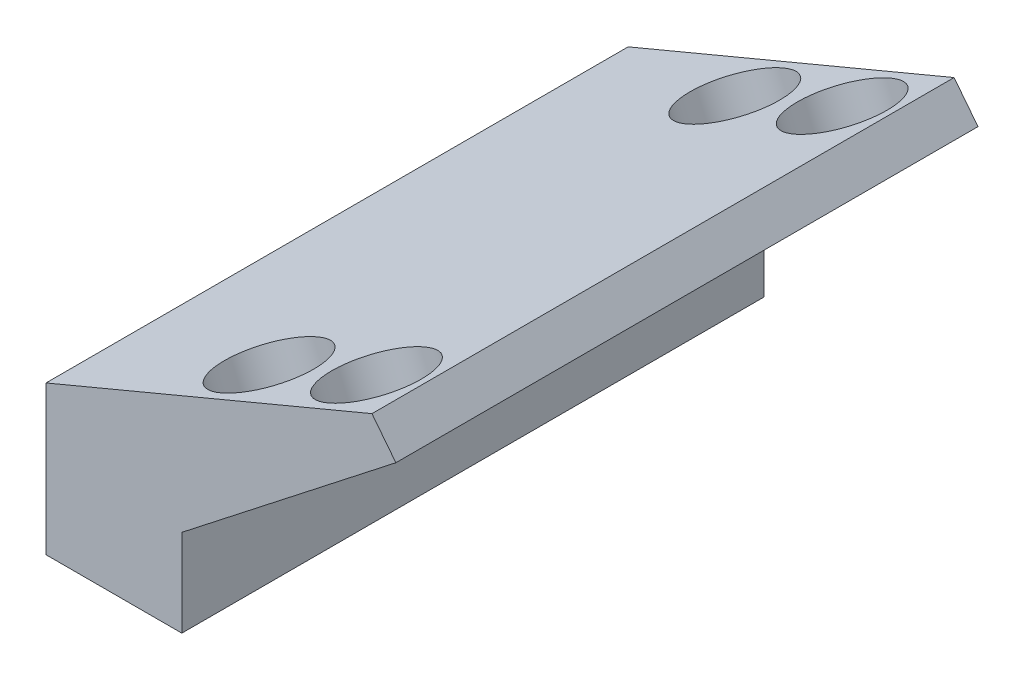
ISO-10303-21;
HEADER;
FILE_DESCRIPTION(('STEP AP214'),'2;1');
FILE_NAME('part.step','',(''),(''),'','','');
FILE_SCHEMA(('AUTOMOTIVE_DESIGN { 1 0 10303 214 1 1 1 1 }'));
ENDSEC;
DATA;
#1=APPLICATION_CONTEXT('core data for automotive mechanical design processes');
#2=APPLICATION_PROTOCOL_DEFINITION('international standard','automotive_design',2000,#1);
#3=PRODUCT_CONTEXT('',#1,'mechanical');
#4=PRODUCT('Part','Part','',(#3));
#5=PRODUCT_RELATED_PRODUCT_CATEGORY('part','',(#4));
#6=PRODUCT_DEFINITION_FORMATION('','',#4);
#7=PRODUCT_DEFINITION_CONTEXT('part definition',#1,'design');
#8=PRODUCT_DEFINITION('design','',#6,#7);
#9=PRODUCT_DEFINITION_SHAPE('','',#8);
#10=(LENGTH_UNIT() NAMED_UNIT(*) SI_UNIT(.MILLI.,.METRE.));
#11=(NAMED_UNIT(*) PLANE_ANGLE_UNIT() SI_UNIT($,.RADIAN.));
#12=(NAMED_UNIT(*) SI_UNIT($,.STERADIAN.) SOLID_ANGLE_UNIT());
#13=UNCERTAINTY_MEASURE_WITH_UNIT(LENGTH_MEASURE(1.E-05),#10,'distance_accuracy_value','');
#14=(GEOMETRIC_REPRESENTATION_CONTEXT(3) GLOBAL_UNCERTAINTY_ASSIGNED_CONTEXT((#13)) GLOBAL_UNIT_ASSIGNED_CONTEXT((#10,
#11,#12)) REPRESENTATION_CONTEXT('',''));
#15=CARTESIAN_POINT('',(0.,0.,0.));
#16=DIRECTION('',(0.,0.,1.));
#17=DIRECTION('',(1.,0.,0.));
#18=AXIS2_PLACEMENT_3D('',#15,#16,#17);
#19=CARTESIAN_POINT('',(7.,0.,30.));
#20=DIRECTION('',(-1.,0.,0.));
#21=DIRECTION('',(0.,0.,1.));
#22=AXIS2_PLACEMENT_3D('',#19,#20,#21);
#23=PLANE('',#22);
#24=DIRECTION('',(0.,1.,0.));
#25=VECTOR('',#24,1.);
#26=CARTESIAN_POINT('',(7.,0.,0.));
#27=LINE('',#26,#25);
#28=CARTESIAN_POINT('',(7.,0.,0.));
#29=VERTEX_POINT('',#28);
#30=CARTESIAN_POINT('',(7.,4.5,0.));
#31=VERTEX_POINT('',#30);
#32=EDGE_CURVE('E125',#29,#31,#27,.T.);
#33=ORIENTED_EDGE('',*,*,#32,.T.);
#34=DIRECTION('',(0.,0.,-1.));
#35=VECTOR('',#34,1.);
#36=CARTESIAN_POINT('',(7.,4.5,30.));
#37=LINE('',#36,#35);
#38=CARTESIAN_POINT('',(7.,4.5,30.));
#39=VERTEX_POINT('',#38);
#40=EDGE_CURVE('E11',#39,#31,#37,.T.);
#41=ORIENTED_EDGE('',*,*,#40,.F.);
#42=DIRECTION('',(0.,1.,0.));
#43=VECTOR('',#42,1.);
#44=CARTESIAN_POINT('',(7.,0.,30.));
#45=LINE('',#44,#43);
#46=CARTESIAN_POINT('',(7.,0.,30.));
#47=VERTEX_POINT('',#46);
#48=EDGE_CURVE('E132',#47,#39,#45,.T.);
#49=ORIENTED_EDGE('',*,*,#48,.F.);
#50=DIRECTION('',(0.,0.,-1.));
#51=VECTOR('',#50,1.);
#52=CARTESIAN_POINT('',(7.,0.,30.));
#53=LINE('',#52,#51);
#54=EDGE_CURVE('E117',#47,#29,#53,.T.);
#55=ORIENTED_EDGE('',*,*,#54,.T.);
#56=EDGE_LOOP('',(#33,#41,#49,#55));
#57=FACE_BOUND('',#56,.T.);
#58=ADVANCED_FACE('F36',(#57),#23,.F.);
#59=CARTESIAN_POINT('',(7.,4.5,30.));
#60=DIRECTION('',(-0.615826443888329,0.787881838226935,0.));
#61=DIRECTION('',(-0.787881838226935,-0.615826443888329,0.));
#62=AXIS2_PLACEMENT_3D('',#59,#60,#61);
#63=PLANE('',#62);
#64=CARTESIAN_POINT('',(10.2473770821052,7.03822411357738,3.));
#65=DIRECTION('',(-0.615826443888329,0.787881838226935,0.));
#66=DIRECTION('',(0.787881838226935,0.615826443888329,0.));
#67=AXIS2_PLACEMENT_3D('',#64,#65,#66);
#68=ELLIPSE('',#67,2.59193810123238,2.5);
#69=CARTESIAN_POINT('',(12.2895180378746,8.63440813723799,3.));
#70=VERTEX_POINT('',#69);
#71=EDGE_CURVE('E127',#70,#70,#68,.T.);
#72=ORIENTED_EDGE('',*,*,#71,.T.);
#73=EDGE_LOOP('',(#72));
#74=FACE_BOUND('',#73,.T.);
#75=CARTESIAN_POINT('',(15.1485153759517,10.8690657703628,27.));
#76=DIRECTION('',(-0.615826443888329,0.787881838226935,0.));
#77=DIRECTION('',(0.787881838226935,0.615826443888329,0.));
#78=AXIS2_PLACEMENT_3D('',#75,#76,#77);
#79=ELLIPSE('',#78,2.59193810123238,2.5);
#80=CARTESIAN_POINT('',(17.1906563317211,12.4652497940234,27.));
#81=VERTEX_POINT('',#80);
#82=EDGE_CURVE('E203',#81,#81,#79,.T.);
#83=ORIENTED_EDGE('',*,*,#82,.T.);
#84=EDGE_LOOP('',(#83));
#85=FACE_BOUND('',#84,.T.);
#86=CARTESIAN_POINT('',(10.2473770821052,7.03822411357738,27.));
#87=DIRECTION('',(-0.615826443888329,0.787881838226935,0.));
#88=DIRECTION('',(0.787881838226935,0.615826443888329,0.));
#89=AXIS2_PLACEMENT_3D('',#86,#87,#88);
#90=ELLIPSE('',#89,2.59193810123238,2.5);
#91=CARTESIAN_POINT('',(12.2895180378746,8.63440813723799,27.));
#92=VERTEX_POINT('',#91);
#93=EDGE_CURVE('E193',#92,#92,#90,.T.);
#94=ORIENTED_EDGE('',*,*,#93,.T.);
#95=EDGE_LOOP('',(#94));
#96=FACE_BOUND('',#95,.T.);
#97=CARTESIAN_POINT('',(15.1485153759517,10.8690657703628,3.));
#98=DIRECTION('',(-0.615826443888329,0.787881838226935,0.));
#99=DIRECTION('',(0.787881838226935,0.615826443888329,0.));
#100=AXIS2_PLACEMENT_3D('',#97,#98,#99);
#101=ELLIPSE('',#100,2.59193810123238,2.5);
#102=CARTESIAN_POINT('',(17.1906563317211,12.4652497940234,3.));
#103=VERTEX_POINT('',#102);
#104=EDGE_CURVE('E191',#103,#103,#101,.T.);
#105=ORIENTED_EDGE('',*,*,#104,.T.);
#106=EDGE_LOOP('',(#105));
#107=FACE_BOUND('',#106,.T.);
#108=DIRECTION('',(0.787881838226935,0.615826443888329,0.));
#109=VECTOR('',#108,1.);
#110=CARTESIAN_POINT('',(7.,4.5,0.));
#111=LINE('',#110,#109);
#112=CARTESIAN_POINT('',(18.0303457351771,13.1215702144366,0.));
#113=VERTEX_POINT('',#112);
#114=EDGE_CURVE('E124',#31,#113,#111,.T.);
#115=ORIENTED_EDGE('',*,*,#114,.T.);
#116=DIRECTION('',(0.,0.,-1.));
#117=VECTOR('',#116,1.);
#118=CARTESIAN_POINT('',(18.0303457351771,13.1215702144366,30.));
#119=LINE('',#118,#117);
#120=CARTESIAN_POINT('',(18.0303457351771,13.1215702144366,30.));
#121=VERTEX_POINT('',#120);
#122=EDGE_CURVE('E46',#121,#113,#119,.T.);
#123=ORIENTED_EDGE('',*,*,#122,.F.);
#124=DIRECTION('',(0.787881838226935,0.615826443888329,0.));
#125=VECTOR('',#124,1.);
#126=CARTESIAN_POINT('',(7.,4.5,30.));
#127=LINE('',#126,#125);
#128=EDGE_CURVE('E93',#39,#121,#127,.T.);
#129=ORIENTED_EDGE('',*,*,#128,.F.);
#130=ORIENTED_EDGE('',*,*,#40,.T.);
#131=EDGE_LOOP('',(#115,#123,#129,#130));
#132=FACE_BOUND('',#131,.T.);
#133=ADVANCED_FACE('F160',(#74,#85,#96,#107,#132),#63,.F.);
#134=CARTESIAN_POINT('',(18.0303457351771,13.1215702144366,30.));
#135=DIRECTION('',(-0.787881838226935,-0.61582644388833,0.));
#136=DIRECTION('',(0.61582644388833,-0.787881838226935,0.));
#137=AXIS2_PLACEMENT_3D('',#134,#135,#136);
#138=PLANE('',#137);
#139=DIRECTION('',(-0.61582644388833,0.787881838226935,0.));
#140=VECTOR('',#139,1.);
#141=CARTESIAN_POINT('',(18.0303457351771,13.1215702144366,0.));
#142=LINE('',#141,#140);
#143=CARTESIAN_POINT('',(16.7986928474004,14.6973338908905,0.));
#144=VERTEX_POINT('',#143);
#145=EDGE_CURVE('E126',#113,#144,#142,.T.);
#146=ORIENTED_EDGE('',*,*,#145,.T.);
#147=DIRECTION('',(0.,0.,-1.));
#148=VECTOR('',#147,1.);
#149=CARTESIAN_POINT('',(16.7986928474004,14.6973338908905,30.));
#150=LINE('',#149,#148);
#151=CARTESIAN_POINT('',(16.7986928474004,14.6973338908905,30.));
#152=VERTEX_POINT('',#151);
#153=EDGE_CURVE('E114',#152,#144,#150,.T.);
#154=ORIENTED_EDGE('',*,*,#153,.F.);
#155=DIRECTION('',(-0.61582644388833,0.787881838226935,0.));
#156=VECTOR('',#155,1.);
#157=CARTESIAN_POINT('',(18.0303457351771,13.1215702144366,30.));
#158=LINE('',#157,#156);
#159=EDGE_CURVE('E102',#121,#152,#158,.T.);
#160=ORIENTED_EDGE('',*,*,#159,.F.);
#161=ORIENTED_EDGE('',*,*,#122,.T.);
#162=EDGE_LOOP('',(#146,#154,#160,#161));
#163=FACE_BOUND('',#162,.T.);
#164=ADVANCED_FACE('F138',(#163),#138,.F.);
#165=CARTESIAN_POINT('',(16.7986928474004,14.6973338908905,30.));
#166=DIRECTION('',(0.386000573805181,-0.922498540390212,0.));
#167=DIRECTION('',(0.922498540390212,0.386000573805181,0.));
#168=AXIS2_PLACEMENT_3D('',#165,#166,#167);
#169=PLANE('',#168);
#170=CARTESIAN_POINT('',(8.49620598388853,11.2233287266439,3.));
#171=DIRECTION('',(-0.386000573805181,0.922498540390212,0.));
#172=DIRECTION('',(-0.922498540390212,-0.386000573805181,0.));
#173=AXIS2_PLACEMENT_3D('',#170,#171,#172);
#174=CIRCLE('',#173,2.5);
#175=CARTESIAN_POINT('',(6.189959632913,10.2583272921309,3.));
#176=VERTEX_POINT('',#175);
#177=EDGE_CURVE('E177',#176,#176,#174,.T.);
#178=ORIENTED_EDGE('',*,*,#177,.F.);
#179=EDGE_LOOP('',(#178));
#180=FACE_BOUND('',#179,.T.);
#181=CARTESIAN_POINT('',(14.0311972262298,13.5393321694749,27.));
#182=DIRECTION('',(-0.386000573805181,0.922498540390212,0.));
#183=DIRECTION('',(-0.922498540390212,-0.386000573805181,0.));
#184=AXIS2_PLACEMENT_3D('',#181,#182,#183);
#185=CIRCLE('',#184,2.5);
#186=CARTESIAN_POINT('',(11.7249508752543,12.574330734962,27.));
#187=VERTEX_POINT('',#186);
#188=EDGE_CURVE('E185',#187,#187,#185,.T.);
#189=ORIENTED_EDGE('',*,*,#188,.F.);
#190=EDGE_LOOP('',(#189));
#191=FACE_BOUND('',#190,.T.);
#192=CARTESIAN_POINT('',(8.49620598388853,11.2233287266439,27.));
#193=DIRECTION('',(-0.386000573805181,0.922498540390212,0.));
#194=DIRECTION('',(-0.922498540390212,-0.386000573805181,0.));
#195=AXIS2_PLACEMENT_3D('',#192,#193,#194);
#196=CIRCLE('',#195,2.5);
#197=CARTESIAN_POINT('',(6.189959632913,10.2583272921309,27.));
#198=VERTEX_POINT('',#197);
#199=EDGE_CURVE('E188',#198,#198,#196,.T.);
#200=ORIENTED_EDGE('',*,*,#199,.F.);
#201=EDGE_LOOP('',(#200));
#202=FACE_BOUND('',#201,.T.);
#203=CARTESIAN_POINT('',(14.0311972262298,13.5393321694749,3.));
#204=DIRECTION('',(-0.386000573805181,0.922498540390212,0.));
#205=DIRECTION('',(-0.922498540390212,-0.386000573805181,0.));
#206=AXIS2_PLACEMENT_3D('',#203,#204,#205);
#207=CIRCLE('',#206,2.5);
#208=CARTESIAN_POINT('',(11.7249508752543,12.574330734962,3.));
#209=VERTEX_POINT('',#208);
#210=EDGE_CURVE('E190',#209,#209,#207,.T.);
#211=ORIENTED_EDGE('',*,*,#210,.F.);
#212=EDGE_LOOP('',(#211));
#213=FACE_BOUND('',#212,.T.);
#214=DIRECTION('',(-0.922498540390212,-0.386000573805181,0.));
#215=VECTOR('',#214,1.);
#216=CARTESIAN_POINT('',(16.7986928474004,14.6973338908905,0.));
#217=LINE('',#216,#215);
#218=CARTESIAN_POINT('',(0.,7.66826577384963,0.));
#219=VERTEX_POINT('',#218);
#220=EDGE_CURVE('E115',#144,#219,#217,.T.);
#221=ORIENTED_EDGE('',*,*,#220,.T.);
#222=DIRECTION('',(0.,0.,-1.));
#223=VECTOR('',#222,1.);
#224=CARTESIAN_POINT('',(0.,7.66826577384963,30.));
#225=LINE('',#224,#223);
#226=CARTESIAN_POINT('',(0.,7.66826577384963,30.));
#227=VERTEX_POINT('',#226);
#228=EDGE_CURVE('E108',#227,#219,#225,.T.);
#229=ORIENTED_EDGE('',*,*,#228,.F.);
#230=DIRECTION('',(-0.922498540390212,-0.386000573805181,0.));
#231=VECTOR('',#230,1.);
#232=CARTESIAN_POINT('',(16.7986928474004,14.6973338908905,30.));
#233=LINE('',#232,#231);
#234=EDGE_CURVE('E98',#152,#227,#233,.T.);
#235=ORIENTED_EDGE('',*,*,#234,.F.);
#236=ORIENTED_EDGE('',*,*,#153,.T.);
#237=EDGE_LOOP('',(#221,#229,#235,#236));
#238=FACE_BOUND('',#237,.T.);
#239=ADVANCED_FACE('F109',(#180,#191,#202,#213,#238),#169,.F.);
#240=CARTESIAN_POINT('',(0.,7.66826577384963,30.));
#241=DIRECTION('',(1.,0.,0.));
#242=DIRECTION('',(0.,0.,-1.));
#243=AXIS2_PLACEMENT_3D('',#240,#241,#242);
#244=PLANE('',#243);
#245=DIRECTION('',(0.,-1.,0.));
#246=VECTOR('',#245,1.);
#247=CARTESIAN_POINT('',(0.,7.66826577384963,0.));
#248=LINE('',#247,#246);
#249=CARTESIAN_POINT('',(0.,0.,0.));
#250=VERTEX_POINT('',#249);
#251=EDGE_CURVE('E79',#219,#250,#248,.T.);
#252=ORIENTED_EDGE('',*,*,#251,.T.);
#253=DIRECTION('',(0.,0.,-1.));
#254=VECTOR('',#253,1.);
#255=CARTESIAN_POINT('',(0.,0.,30.));
#256=LINE('',#255,#254);
#257=CARTESIAN_POINT('',(0.,0.,30.));
#258=VERTEX_POINT('',#257);
#259=EDGE_CURVE('E111',#258,#250,#256,.T.);
#260=ORIENTED_EDGE('',*,*,#259,.F.);
#261=DIRECTION('',(0.,-1.,0.));
#262=VECTOR('',#261,1.);
#263=CARTESIAN_POINT('',(0.,7.66826577384963,30.));
#264=LINE('',#263,#262);
#265=EDGE_CURVE('E105',#227,#258,#264,.T.);
#266=ORIENTED_EDGE('',*,*,#265,.F.);
#267=ORIENTED_EDGE('',*,*,#228,.T.);
#268=EDGE_LOOP('',(#252,#260,#266,#267));
#269=FACE_BOUND('',#268,.T.);
#270=ADVANCED_FACE('F118',(#269),#244,.F.);
#271=CARTESIAN_POINT('',(0.,0.,30.));
#272=DIRECTION('',(0.,1.,0.));
#273=DIRECTION('',(0.,0.,1.));
#274=AXIS2_PLACEMENT_3D('',#271,#272,#273);
#275=PLANE('',#274);
#276=DIRECTION('',(1.,0.,0.));
#277=VECTOR('',#276,1.);
#278=CARTESIAN_POINT('',(0.,0.,0.));
#279=LINE('',#278,#277);
#280=EDGE_CURVE('E82',#250,#29,#279,.T.);
#281=ORIENTED_EDGE('',*,*,#280,.T.);
#282=ORIENTED_EDGE('',*,*,#54,.F.);
#283=DIRECTION('',(1.,0.,0.));
#284=VECTOR('',#283,1.);
#285=CARTESIAN_POINT('',(0.,0.,30.));
#286=LINE('',#285,#284);
#287=EDGE_CURVE('E53',#258,#47,#286,.T.);
#288=ORIENTED_EDGE('',*,*,#287,.F.);
#289=ORIENTED_EDGE('',*,*,#259,.T.);
#290=EDGE_LOOP('',(#281,#282,#288,#289));
#291=FACE_BOUND('',#290,.T.);
#292=ADVANCED_FACE('F148',(#291),#275,.F.);
#293=CARTESIAN_POINT('',(0.,0.,30.));
#294=DIRECTION('',(0.,0.,-1.));
#295=DIRECTION('',(-1.,0.,0.));
#296=AXIS2_PLACEMENT_3D('',#293,#294,#295);
#297=PLANE('',#296);
#298=ORIENTED_EDGE('',*,*,#48,.T.);
#299=ORIENTED_EDGE('',*,*,#128,.T.);
#300=ORIENTED_EDGE('',*,*,#159,.T.);
#301=ORIENTED_EDGE('',*,*,#234,.T.);
#302=ORIENTED_EDGE('',*,*,#265,.T.);
#303=ORIENTED_EDGE('',*,*,#287,.T.);
#304=EDGE_LOOP('',(#298,#299,#300,#301,#302,#303));
#305=FACE_BOUND('',#304,.T.);
#306=ADVANCED_FACE('F99',(#305),#297,.F.);
#307=CARTESIAN_POINT('',(0.,0.,0.));
#308=DIRECTION('',(0.,0.,-1.));
#309=DIRECTION('',(-1.,0.,0.));
#310=AXIS2_PLACEMENT_3D('',#307,#308,#309);
#311=PLANE('',#310);
#312=ORIENTED_EDGE('',*,*,#32,.F.);
#313=ORIENTED_EDGE('',*,*,#280,.F.);
#314=ORIENTED_EDGE('',*,*,#251,.F.);
#315=ORIENTED_EDGE('',*,*,#220,.F.);
#316=ORIENTED_EDGE('',*,*,#145,.F.);
#317=ORIENTED_EDGE('',*,*,#114,.F.);
#318=EDGE_LOOP('',(#312,#313,#314,#315,#316,#317));
#319=FACE_BOUND('',#318,.T.);
#320=ADVANCED_FACE('F142',(#319),#311,.T.);
#321=CARTESIAN_POINT('',(23.6812115713593,-9.52313134028036,3.));
#322=DIRECTION('',(-0.386000573805181,0.922498540390212,0.));
#323=DIRECTION('',(-0.922498540390212,-0.386000573805181,0.));
#324=AXIS2_PLACEMENT_3D('',#321,#322,#323);
#325=CYLINDRICAL_SURFACE('',#324,2.5);
#326=ORIENTED_EDGE('',*,*,#210,.T.);
#327=EDGE_LOOP('',(#326));
#328=FACE_BOUND('',#327,.T.);
#329=ORIENTED_EDGE('',*,*,#104,.F.);
#330=EDGE_LOOP('',(#329));
#331=FACE_BOUND('',#330,.T.);
#332=ADVANCED_FACE('F222',(#328,#331),#325,.F.);
#333=CARTESIAN_POINT('',(18.1462203290181,-11.8391347831114,27.));
#334=DIRECTION('',(-0.386000573805181,0.922498540390212,0.));
#335=DIRECTION('',(-0.922498540390212,-0.386000573805181,0.));
#336=AXIS2_PLACEMENT_3D('',#333,#334,#335);
#337=CYLINDRICAL_SURFACE('',#336,2.5);
#338=ORIENTED_EDGE('',*,*,#199,.T.);
#339=EDGE_LOOP('',(#338));
#340=FACE_BOUND('',#339,.T.);
#341=ORIENTED_EDGE('',*,*,#93,.F.);
#342=EDGE_LOOP('',(#341));
#343=FACE_BOUND('',#342,.T.);
#344=ADVANCED_FACE('F216',(#340,#343),#337,.F.);
#345=CARTESIAN_POINT('',(23.6812115713593,-9.52313134028036,27.));
#346=DIRECTION('',(-0.386000573805181,0.922498540390212,0.));
#347=DIRECTION('',(-0.922498540390212,-0.386000573805181,0.));
#348=AXIS2_PLACEMENT_3D('',#345,#346,#347);
#349=CYLINDRICAL_SURFACE('',#348,2.5);
#350=ORIENTED_EDGE('',*,*,#188,.T.);
#351=EDGE_LOOP('',(#350));
#352=FACE_BOUND('',#351,.T.);
#353=ORIENTED_EDGE('',*,*,#82,.F.);
#354=EDGE_LOOP('',(#353));
#355=FACE_BOUND('',#354,.T.);
#356=ADVANCED_FACE('F209',(#352,#355),#349,.F.);
#357=CARTESIAN_POINT('',(18.1462203290181,-11.8391347831114,3.));
#358=DIRECTION('',(-0.386000573805181,0.922498540390212,0.));
#359=DIRECTION('',(-0.922498540390212,-0.386000573805181,0.));
#360=AXIS2_PLACEMENT_3D('',#357,#358,#359);
#361=CYLINDRICAL_SURFACE('',#360,2.5);
#362=ORIENTED_EDGE('',*,*,#177,.T.);
#363=EDGE_LOOP('',(#362));
#364=FACE_BOUND('',#363,.T.);
#365=ORIENTED_EDGE('',*,*,#71,.F.);
#366=EDGE_LOOP('',(#365));
#367=FACE_BOUND('',#366,.T.);
#368=ADVANCED_FACE('F208',(#364,#367),#361,.F.);
#369=CLOSED_SHELL('',(#58,#133,#164,#239,#270,#292,#306,#320,#332,#344,#356,#368));
#370=MANIFOLD_SOLID_BREP('B2',#369);
#371=ADVANCED_BREP_SHAPE_REPRESENTATION('',(#18,#370),#14);
#372=SHAPE_DEFINITION_REPRESENTATION(#9,#371);
ENDSEC;
END-ISO-10303-21;
